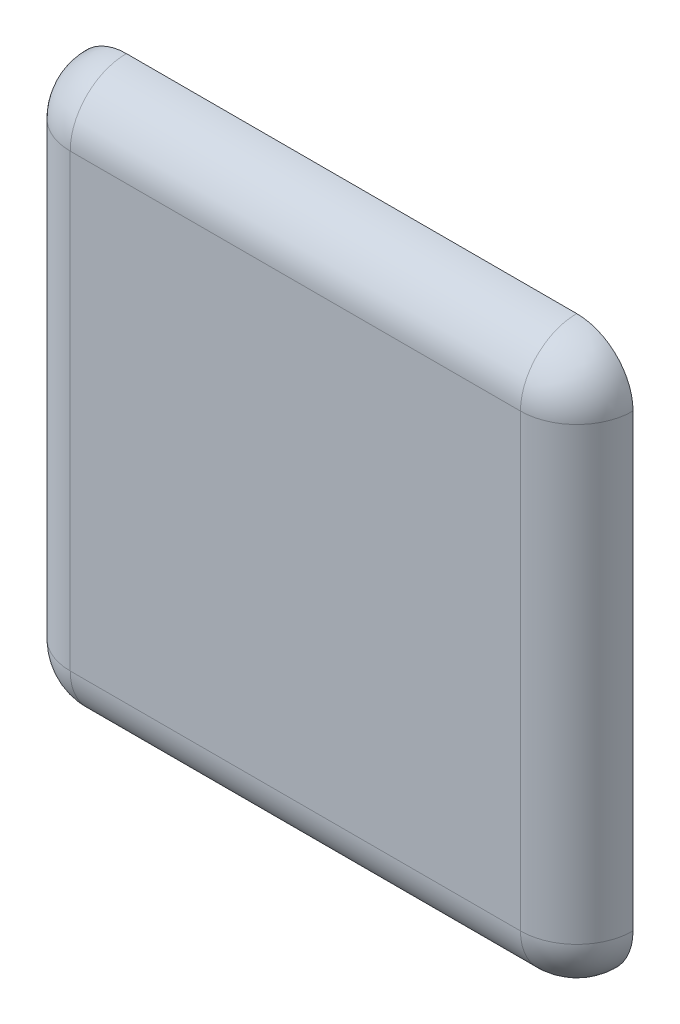
ISO-10303-21;
HEADER;
FILE_DESCRIPTION(('STEP AP214'),'2;1');
FILE_NAME('part.step','',(''),(''),'','','');
FILE_SCHEMA(('AUTOMOTIVE_DESIGN { 1 0 10303 214 1 1 1 1 }'));
ENDSEC;
DATA;
#1=APPLICATION_CONTEXT('core data for automotive mechanical design processes');
#2=APPLICATION_PROTOCOL_DEFINITION('international standard','automotive_design',2000,#1);
#3=PRODUCT_CONTEXT('',#1,'mechanical');
#4=PRODUCT('Part','Part','',(#3));
#5=PRODUCT_RELATED_PRODUCT_CATEGORY('part','',(#4));
#6=PRODUCT_DEFINITION_FORMATION('','',#4);
#7=PRODUCT_DEFINITION_CONTEXT('part definition',#1,'design');
#8=PRODUCT_DEFINITION('design','',#6,#7);
#9=PRODUCT_DEFINITION_SHAPE('','',#8);
#10=(LENGTH_UNIT() NAMED_UNIT(*) SI_UNIT(.MILLI.,.METRE.));
#11=(NAMED_UNIT(*) PLANE_ANGLE_UNIT() SI_UNIT($,.RADIAN.));
#12=(NAMED_UNIT(*) SI_UNIT($,.STERADIAN.) SOLID_ANGLE_UNIT());
#13=UNCERTAINTY_MEASURE_WITH_UNIT(LENGTH_MEASURE(1.E-05),#10,'distance_accuracy_value','');
#14=(GEOMETRIC_REPRESENTATION_CONTEXT(3) GLOBAL_UNCERTAINTY_ASSIGNED_CONTEXT((#13)) GLOBAL_UNIT_ASSIGNED_CONTEXT((#10,
#11,#12)) REPRESENTATION_CONTEXT('',''));
#15=CARTESIAN_POINT('',(0.,0.,0.));
#16=DIRECTION('',(0.,0.,1.));
#17=DIRECTION('',(1.,0.,0.));
#18=AXIS2_PLACEMENT_3D('',#15,#16,#17);
#19=CARTESIAN_POINT('',(4.,4.,4.));
#20=DIRECTION('',(0.,0.,1.));
#21=DIRECTION('',(1.,0.,0.));
#22=AXIS2_PLACEMENT_3D('',#19,#20,#21);
#23=PLANE('',#22);
#24=DIRECTION('',(-1.,0.,0.));
#25=VECTOR('',#24,1.);
#26=CARTESIAN_POINT('',(36.,4.00000000000005,3.99999999999999));
#27=LINE('',#26,#25);
#28=CARTESIAN_POINT('',(35.9999999997224,4.00000000000002,3.99999999999947));
#29=VERTEX_POINT('',#28);
#30=CARTESIAN_POINT('',(3.99999999999996,4.00000000000002,4.00000000000005));
#31=VERTEX_POINT('',#30);
#32=EDGE_CURVE('E90',#29,#31,#27,.T.);
#33=ORIENTED_EDGE('',*,*,#32,.F.);
#34=DIRECTION('',(0.,-1.,0.));
#35=VECTOR('',#34,1.);
#36=CARTESIAN_POINT('',(36.,36.,3.99999999999896));
#37=LINE('',#36,#35);
#38=CARTESIAN_POINT('',(36.,35.9999946842105,3.99999999999953));
#39=VERTEX_POINT('',#38);
#40=EDGE_CURVE('E67',#39,#29,#37,.T.);
#41=ORIENTED_EDGE('',*,*,#40,.F.);
#42=DIRECTION('',(1.,0.,0.));
#43=VECTOR('',#42,1.);
#44=CARTESIAN_POINT('',(4.,35.999996,4.));
#45=LINE('',#44,#43);
#46=CARTESIAN_POINT('',(3.99999712928426,35.9999935086057,3.99999999999928));
#47=VERTEX_POINT('',#46);
#48=EDGE_CURVE('E112',#47,#39,#45,.T.);
#49=ORIENTED_EDGE('',*,*,#48,.F.);
#50=DIRECTION('',(0.,-1.,0.));
#51=VECTOR('',#50,1.);
#52=CARTESIAN_POINT('',(4.,36.,4.00000000000012));
#53=LINE('',#52,#51);
#54=EDGE_CURVE('E91',#31,#47,#53,.F.);
#55=ORIENTED_EDGE('',*,*,#54,.F.);
#56=EDGE_LOOP('',(#33,#41,#49,#55));
#57=FACE_BOUND('',#56,.T.);
#58=ADVANCED_FACE('F16',(#57),#23,.T.);
#59=CARTESIAN_POINT('',(36.,36.,0.));
#60=DIRECTION('',(0.381049633011538,-0.924554583127342,0.));
#61=DIRECTION('',(0.,0.,-1.));
#62=AXIS2_PLACEMENT_3D('',#59,#60,#61);
#63=SPHERICAL_SURFACE('',#62,3.99999999999981);
#64=CARTESIAN_POINT('',(36.,39.9999999999998,0.));
#65=CARTESIAN_POINT('',(36.1125064846693,40.0000107801648,0.));
#66=CARTESIAN_POINT('',(36.2250078596814,39.9952533978363,0.));
#67=CARTESIAN_POINT('',(36.4492056808409,39.9762857323358,0.));
#68=CARTESIAN_POINT('',(36.5609021653405,39.9620759026152,0.));
#69=CARTESIAN_POINT('',(36.7826226412642,39.9243010286425,0.));
#70=CARTESIAN_POINT('',(36.8926478326796,39.900743061469,0.));
#71=CARTESIAN_POINT('',(37.1102957536248,39.844463003552,0.));
#72=CARTESIAN_POINT('',(37.2179185124643,39.8117410246754,0.));
#73=CARTESIAN_POINT('',(37.5361447238502,39.7000934071667,0.));
#74=CARTESIAN_POINT('',(37.7421963398768,39.6076706332295,0.));
#75=CARTESIAN_POINT('',(38.1357069471823,39.3896049845834,0.));
#76=CARTESIAN_POINT('',(38.3231692057971,39.2639679620187,0.));
#77=CARTESIAN_POINT('',(38.6743715803179,38.9829981889779,0.));
#78=CARTESIAN_POINT('',(38.8381119277055,38.8276657283084,0.));
#79=CARTESIAN_POINT('',(39.1372150568841,38.4916826745307,0.));
#80=CARTESIAN_POINT('',(39.2725722809908,38.3110271344569,0.));
#81=CARTESIAN_POINT('',(39.5110563074748,37.9295368825368,0.));
#82=CARTESIAN_POINT('',(39.6141767999037,37.7286982302454,0.));
#83=CARTESIAN_POINT('',(39.7851821448691,37.3125987428058,0.));
#84=CARTESIAN_POINT('',(39.85308763485,37.0973464383638,0.));
#85=CARTESIAN_POINT('',(39.9348605214169,36.7339807389415,0.));
#86=CARTESIAN_POINT('',(39.9592730691926,36.5881531888869,0.));
#87=CARTESIAN_POINT('',(39.9918406722692,36.2949041344534,0.));
#88=CARTESIAN_POINT('',(40.0000187754479,36.1474851889585,0.));
#89=CARTESIAN_POINT('',(39.9999999999998,36.0000000000001,0.));
#90=B_SPLINE_CURVE_WITH_KNOTS('',3,(#64,#65,#66,#67,#68,#69,#70,#71,#72,#73,#74,#75,#76,#77,#78,
#79,#80,#81,#82,#83,#84,#85,#86,#87,#88,#89),.UNSPECIFIED.,.F.,.F.,(4,2,2,2,2,2,2,2,2,2,2,2,4),
(0.,0.337409690213665,0.67480319543045,1.01194176015813,1.34907620955057,2.0230739401626,
2.69695299561828,3.37082547482495,4.04482978167727,4.71896593418993,5.39270656736756,
5.83543557899232,6.27753560189483),.UNSPECIFIED.);
#91=CARTESIAN_POINT('',(36.,39.9999947435897,0.));
#92=VERTEX_POINT('',#91);
#93=CARTESIAN_POINT('',(39.9999999999998,36.,0.));
#94=VERTEX_POINT('',#93);
#95=EDGE_CURVE('E114',#92,#94,#90,.T.);
#96=ORIENTED_EDGE('',*,*,#95,.F.);
#97=CARTESIAN_POINT('',(36.,39.9999999999998,0.));
#98=CARTESIAN_POINT('',(35.9998688575037,40.0000019971717,0.0741499115087347));
#99=CARTESIAN_POINT('',(35.9996634653782,39.9979381764213,0.148297534384109));
#100=CARTESIAN_POINT('',(35.9993613868557,39.9897283979858,0.29575447126633));
#101=CARTESIAN_POINT('',(35.9992638198746,39.9836161701219,0.369065662874321));
#102=CARTESIAN_POINT('',(35.9994259186972,39.9671710629177,0.516927306225582));
#103=CARTESIAN_POINT('',(35.9996938654899,39.9567442001479,0.591467402446289));
#104=CARTESIAN_POINT('',(35.9999296973092,39.9377551802846,0.703986049895479));
#105=CARTESIAN_POINT('',(35.9999800093617,39.9307260849795,0.742229077632274));
#106=CARTESIAN_POINT('',(36.0000180127648,39.9163065782062,0.814720880166266));
#107=CARTESIAN_POINT('',(36.0000114072958,39.9090207240106,0.848990480687904));
#108=CARTESIAN_POINT('',(36.0000189047329,39.8853680474023,0.953473393796539));
#109=CARTESIAN_POINT('',(36.0000623030139,39.8675476206768,1.02336344051721));
#110=CARTESIAN_POINT('',(36.0001028626414,39.8272511846955,1.1652622400748));
#111=CARTESIAN_POINT('',(36.0000978075734,39.8045988657436,1.2372207646469));
#112=CARTESIAN_POINT('',(36.000044814736,39.7540029992481,1.38338079503995));
#113=CARTESIAN_POINT('',(35.9999947026982,39.7258484896679,1.45750948079151));
#114=CARTESIAN_POINT('',(36.000004639236,39.6689556082825,1.59486157769519));
#115=CARTESIAN_POINT('',(36.0000517762732,39.6407242551765,1.65829574165852));
#116=CARTESIAN_POINT('',(36.0001198970815,39.5791706206391,1.78744597654392));
#117=CARTESIAN_POINT('',(36.000139103254,39.5456424891737,1.85306403062664));
#118=CARTESIAN_POINT('',(36.0001149896539,39.4729108847294,1.98619729919671));
#119=CARTESIAN_POINT('',(36.0000678837092,39.4334884819679,2.05359328335936));
#120=CARTESIAN_POINT('',(36.000015516438,39.3705707533184,2.15427691551824));
#121=CARTESIAN_POINT('',(36.0000010182437,39.3484825750178,2.18845146157392));
#122=CARTESIAN_POINT('',(35.9999991447019,39.306891573991,2.25069680361676));
#123=CARTESIAN_POINT('',(36.0000078002655,39.2875406688526,2.27886920498947));
#124=CARTESIAN_POINT('',(36.0000382400153,39.2265658435209,2.36524668665095));
#125=CARTESIAN_POINT('',(36.0000640297925,39.1837276153498,2.42260157090797));
#126=CARTESIAN_POINT('',(36.0000856046635,39.0923680353393,2.53830984038226));
#127=CARTESIAN_POINT('',(36.0000794896678,39.0436598014502,2.59651541754769));
#128=CARTESIAN_POINT('',(36.0000253786692,38.9401373063948,2.71330480141099));
#129=CARTESIAN_POINT('',(35.9999750133001,38.8851332277528,2.77172075077228));
#130=CARTESIAN_POINT('',(36.0000194453896,38.7842967565233,2.8725577038434));
#131=CARTESIAN_POINT('',(36.0000845271058,38.7391355720171,2.91565289344596));
#132=CARTESIAN_POINT('',(36.0002707532634,38.6438076798909,3.00244972413262));
#133=CARTESIAN_POINT('',(36.0003953050456,38.5935071443467,3.04600466240609));
#134=CARTESIAN_POINT('',(36.0006047991188,38.4876078714315,3.13317702498547));
#135=CARTESIAN_POINT('',(36.0006868010711,38.431874099811,3.17663033808881));
#136=CARTESIAN_POINT('',(36.0007768580552,38.314844027704,3.26298781235745));
#137=CARTESIAN_POINT('',(36.0007802932934,38.2534132077562,3.30571024444259));
#138=CARTESIAN_POINT('',(36.0007265322902,38.158249251415,3.3680079765191));
#139=CARTESIAN_POINT('',(36.0006975988755,38.1253483104449,3.38886582840333));
#140=CARTESIAN_POINT('',(36.0006233074174,38.0580666191379,3.43015454418903));
#141=CARTESIAN_POINT('',(36.0005775327533,38.0236697888585,3.45055927162724));
#142=CARTESIAN_POINT('',(36.0004753544422,37.9533814501278,3.49084284978111));
#143=CARTESIAN_POINT('',(36.0004187062404,37.9174743022124,3.51069439831566));
#144=CARTESIAN_POINT('',(36.000304047729,37.8441537545001,3.54976981508934));
#145=CARTESIAN_POINT('',(36.0002460390726,37.8067252005113,3.56896525453618));
#146=CARTESIAN_POINT('',(36.000139387514,37.7303556278612,3.60662253508331));
#147=CARTESIAN_POINT('',(36.0000910092802,37.6914000305486,3.62505482780203));
#148=CARTESIAN_POINT('',(36.0000229758341,37.6119771490796,3.66107585071195));
#149=CARTESIAN_POINT('',(36.0000040341745,37.5714959811056,3.67863392225586));
#150=CARTESIAN_POINT('',(35.9999938022796,37.4681104994478,3.72145741419337));
#151=CARTESIAN_POINT('',(36.0000227896744,37.4048238469085,3.74580622390123));
#152=CARTESIAN_POINT('',(36.000059954361,37.2718119037336,3.79313618377973));
#153=CARTESIAN_POINT('',(36.0000662111509,37.2019871708334,3.81583743583964));
#154=CARTESIAN_POINT('',(36.0000560939482,37.0558047467433,3.85895291631939));
#155=CARTESIAN_POINT('',(36.0000379528638,36.9793557789751,3.87905952434512));
#156=CARTESIAN_POINT('',(36.0000045727092,36.8618498112004,3.90627021448755));
#157=CARTESIAN_POINT('',(35.9999920242894,36.8211682202525,3.91502411032708));
#158=CARTESIAN_POINT('',(36.0000050867305,36.7543347485663,3.92831812717278));
#159=CARTESIAN_POINT('',(36.0000185218646,36.7282575105623,3.93323601655372));
#160=CARTESIAN_POINT('',(36.0000757928939,36.6391976321281,3.94911537626633));
#161=CARTESIAN_POINT('',(36.0001357909835,36.5759857363489,3.95882890007477));
#162=CARTESIAN_POINT('',(36.0001739822513,36.475491656866,3.97181407931485));
#163=CARTESIAN_POINT('',(36.0001757900704,36.4383342948666,3.97608626054823));
#164=CARTESIAN_POINT('',(36.0001627179511,36.3603074709583,3.98395044168892));
#165=CARTESIAN_POINT('',(36.000146204117,36.3194271745855,3.98743642876922));
#166=CARTESIAN_POINT('',(36.000101208211,36.2339652583028,3.99340123801248));
#167=CARTESIAN_POINT('',(36.0000717981246,36.1893755413413,3.99576395197174));
#168=CARTESIAN_POINT('',(36.0000210919496,36.0965257686974,3.99912651788117));
#169=CARTESIAN_POINT('',(36.0000006466145,36.0482611232549,4.00000040035484));
#170=CARTESIAN_POINT('',(36.,35.999996,3.99999999999781));
#171=B_SPLINE_CURVE_WITH_KNOTS('',3,(#97,#98,#99,#100,#101,#102,#103,#104,#105,#106,#107,#108,
#109,#110,#111,#112,#113,#114,#115,#116,#117,#118,#119,#120,#121,#122,#123,#124,#125,#126,#127,
#128,#129,#130,#131,#132,#133,#134,#135,#136,#137,#138,#139,#140,#141,#142,#143,#144,#145,#146,
#147,#148,#149,#150,#151,#152,#153,#154,#155,#156,#157,#158,#159,#160,#161,#162,#163,#164,#165,
#166,#167,#168,#169,#170),.UNSPECIFIED.,.F.,.F.,(4,2,2,2,2,2,2,2,2,2,2,2,2,2,2,2,2,2,2,2,2,2,2,
2,2,2,2,2,2,2,2,2,2,2,2,2,4),(0.,0.222417107578206,0.443004044110374,0.668672421346964,
0.785308823638932,0.890405222375579,1.10666933983325,1.33287163712365,1.57061238118346,
1.77881939773179,1.9997717475497,2.23386354770104,2.35592082185082,2.45844574378606,
2.673094651718,2.90066765537036,3.14122346247322,3.32843111354935,3.52795779172504,
3.73987604251078,3.96422516151148,4.0810776682581,4.20104000281386,4.32410892820753,
4.45027954738558,4.57954535153261,4.71189826888605,4.91523264939009,5.13539273468387,
5.37238779162185,5.49720749150748,5.57681471375602,5.76858810199226,5.88078288114727,
6.00384852654176,6.13778054109232,6.28256687091075),.UNSPECIFIED.);
#172=EDGE_CURVE('E109',#39,#92,#171,.F.);
#173=ORIENTED_EDGE('',*,*,#172,.F.);
#174=CARTESIAN_POINT('',(36.0000000000002,36.,-5.14996031930615E-13));
#175=DIRECTION('',(0.,-1.,0.));
#176=DIRECTION('',(0.,0.,-1.));
#177=AXIS2_PLACEMENT_3D('',#174,#175,#176);
#178=CIRCLE('',#177,3.99999999999947);
#179=EDGE_CURVE('E74',#94,#39,#178,.T.);
#180=ORIENTED_EDGE('',*,*,#179,.F.);
#181=EDGE_LOOP('',(#96,#173,#180));
#182=FACE_BOUND('',#181,.T.);
#183=ADVANCED_FACE('F125',(#182),#63,.T.);
#184=CARTESIAN_POINT('',(36.0000000000002,36.,-5.14996031930615E-13));
#185=DIRECTION('',(0.,-1.,0.));
#186=DIRECTION('',(0.,0.,-1.));
#187=AXIS2_PLACEMENT_3D('',#184,#185,#186);
#188=CYLINDRICAL_SURFACE('',#187,3.99999999999947);
#189=CARTESIAN_POINT('',(36.0000000000002,4.,-5.14996031930615E-13));
#190=DIRECTION('',(0.,-1.,0.));
#191=DIRECTION('',(0.,0.,-1.));
#192=AXIS2_PLACEMENT_3D('',#189,#190,#191);
#193=CIRCLE('',#192,3.99999999999947);
#194=CARTESIAN_POINT('',(39.9999999999999,4.,0.));
#195=VERTEX_POINT('',#194);
#196=EDGE_CURVE('E71',#195,#29,#193,.T.);
#197=ORIENTED_EDGE('',*,*,#196,.F.);
#198=DIRECTION('',(0.,1.,0.));
#199=VECTOR('',#198,1.);
#200=CARTESIAN_POINT('',(39.9999999999999,0.,0.));
#201=LINE('',#200,#199);
#202=EDGE_CURVE('E212',#94,#195,#201,.F.);
#203=ORIENTED_EDGE('',*,*,#202,.F.);
#204=ORIENTED_EDGE('',*,*,#179,.T.);
#205=ORIENTED_EDGE('',*,*,#40,.T.);
#206=EDGE_LOOP('',(#197,#203,#204,#205));
#207=FACE_BOUND('',#206,.T.);
#208=ADVANCED_FACE('F69',(#207),#188,.T.);
#209=CARTESIAN_POINT('',(36.,4.,0.));
#210=DIRECTION('',(-0.924554583722734,-0.381049631566916,0.));
#211=DIRECTION('',(0.,0.,-1.));
#212=AXIS2_PLACEMENT_3D('',#209,#210,#211);
#213=SPHERICAL_SURFACE('',#212,4.00000000000004);
#214=CARTESIAN_POINT('',(40.,4.,0.));
#215=CARTESIAN_POINT('',(40.0000107801651,3.88749351533068,0.));
#216=CARTESIAN_POINT('',(39.9952533978365,3.77499214031856,0.));
#217=CARTESIAN_POINT('',(39.9762857323361,3.55079431915905,0.));
#218=CARTESIAN_POINT('',(39.9620759026154,3.43909783465939,0.));
#219=CARTESIAN_POINT('',(39.9243010286428,3.21737735873567,0.));
#220=CARTESIAN_POINT('',(39.9007430614692,3.10735216732032,0.));
#221=CARTESIAN_POINT('',(39.8444630035522,2.88970424637512,0.));
#222=CARTESIAN_POINT('',(39.8117410246756,2.78208148753563,0.));
#223=CARTESIAN_POINT('',(39.7000934071669,2.46385527614969,0.));
#224=CARTESIAN_POINT('',(39.6076706332297,2.2578036601231,0.));
#225=CARTESIAN_POINT('',(39.3896049845836,1.8642930528176,0.));
#226=CARTESIAN_POINT('',(39.2639679620188,1.67683079420275,0.));
#227=CARTESIAN_POINT('',(38.9829981889781,1.32562841968195,0.));
#228=CARTESIAN_POINT('',(38.8276657283085,1.16188807229427,0.));
#229=CARTESIAN_POINT('',(38.4916826745307,0.862784943115719,0.));
#230=CARTESIAN_POINT('',(38.311027134457,0.727427719008949,0.));
#231=CARTESIAN_POINT('',(37.9295368825369,0.488943692525088,0.));
#232=CARTESIAN_POINT('',(37.7286982302457,0.385823200096153,0.));
#233=CARTESIAN_POINT('',(37.3125987428061,0.214817855130728,0.));
#234=CARTESIAN_POINT('',(37.097346438364,0.146912365149814,0.));
#235=CARTESIAN_POINT('',(36.7339807388513,0.0651394785626091,0.));
#236=CARTESIAN_POINT('',(36.5881531887041,0.0407269307766143,0.));
#237=CARTESIAN_POINT('',(36.2949041340843,0.00815932769984238,0.));
#238=CARTESIAN_POINT('',(36.1474851884957,-1.87754686897813E-05,0.));
#239=CARTESIAN_POINT('',(35.9999999994447,0.,0.));
#240=B_SPLINE_CURVE_WITH_KNOTS('',3,(#214,#215,#216,#217,#218,#219,#220,#221,#222,#223,#224,
#225,#226,#227,#228,#229,#230,#231,#232,#233,#234,#235,#236,#237,#238,#239),.UNSPECIFIED.,.F.,
.F.,(4,2,2,2,2,2,2,2,2,2,2,2,4),(0.,0.337409690213699,0.674803195430522,1.01194176015821,
1.34907620955065,2.02307394016269,2.69695299561845,3.37082547482525,4.04482978167751,
4.71896593418987,5.39270656736788,5.8354355792698,6.27753560244972),.UNSPECIFIED.);
#241=CARTESIAN_POINT('',(35.9999999994446,0.,0.));
#242=VERTEX_POINT('',#241);
#243=EDGE_CURVE('E86',#195,#242,#240,.T.);
#244=ORIENTED_EDGE('',*,*,#243,.F.);
#245=ORIENTED_EDGE('',*,*,#196,.T.);
#246=CARTESIAN_POINT('',(35.9999999994446,4.00000000000005,0.));
#247=DIRECTION('',(-1.,0.,0.));
#248=DIRECTION('',(0.,0.,1.));
#249=AXIS2_PLACEMENT_3D('',#246,#247,#248);
#250=CIRCLE('',#249,4.);
#251=EDGE_CURVE('E83',#242,#29,#250,.T.);
#252=ORIENTED_EDGE('',*,*,#251,.F.);
#253=EDGE_LOOP('',(#244,#245,#252));
#254=FACE_BOUND('',#253,.T.);
#255=ADVANCED_FACE('F81',(#254),#213,.T.);
#256=CARTESIAN_POINT('',(36.,4.00000000000005,0.));
#257=DIRECTION('',(-1.,0.,0.));
#258=DIRECTION('',(0.,0.,1.));
#259=AXIS2_PLACEMENT_3D('',#256,#257,#258);
#260=CYLINDRICAL_SURFACE('',#259,4.);
#261=ORIENTED_EDGE('',*,*,#251,.T.);
#262=ORIENTED_EDGE('',*,*,#32,.T.);
#263=CARTESIAN_POINT('',(4.,4.00000000000005,0.));
#264=DIRECTION('',(-1.,0.,0.));
#265=DIRECTION('',(0.,0.,1.));
#266=AXIS2_PLACEMENT_3D('',#263,#264,#265);
#267=CIRCLE('',#266,4.);
#268=CARTESIAN_POINT('',(4.,0.,0.));
#269=VERTEX_POINT('',#268);
#270=EDGE_CURVE('E95',#269,#31,#267,.T.);
#271=ORIENTED_EDGE('',*,*,#270,.F.);
#272=DIRECTION('',(-1.,0.,0.));
#273=VECTOR('',#272,1.);
#274=CARTESIAN_POINT('',(40.,0.,0.));
#275=LINE('',#274,#273);
#276=EDGE_CURVE('E99',#242,#269,#275,.T.);
#277=ORIENTED_EDGE('',*,*,#276,.F.);
#278=EDGE_LOOP('',(#261,#262,#271,#277));
#279=FACE_BOUND('',#278,.T.);
#280=ADVANCED_FACE('F97',(#279),#260,.T.);
#281=CARTESIAN_POINT('',(4.,4.,0.));
#282=DIRECTION('',(-0.381049631566923,0.924554583722731,0.));
#283=DIRECTION('',(0.,0.,-1.));
#284=AXIS2_PLACEMENT_3D('',#281,#282,#283);
#285=SPHERICAL_SURFACE('',#284,4.00000000000001);
#286=CARTESIAN_POINT('',(4.,0.,0.));
#287=CARTESIAN_POINT('',(3.88749351533069,-1.07801650150983E-05,0.));
#288=CARTESIAN_POINT('',(3.77499214031857,0.00474660216351378,0.));
#289=CARTESIAN_POINT('',(3.55079431915907,0.0237142676639687,0.));
#290=CARTESIAN_POINT('',(3.43909783465941,0.0379240973845905,0.));
#291=CARTESIAN_POINT('',(3.21737735873569,0.0756989713572767,0.));
#292=CARTESIAN_POINT('',(3.10735216732034,0.0992569385308615,0.));
#293=CARTESIAN_POINT('',(2.88970424637514,0.155536996447869,0.));
#294=CARTESIAN_POINT('',(2.78208148753564,0.188258975324456,0.));
#295=CARTESIAN_POINT('',(2.46385527614969,0.299906592833119,0.));
#296=CARTESIAN_POINT('',(2.25780366012309,0.392329366770341,0.));
#297=CARTESIAN_POINT('',(1.8642930528176,0.610395015416484,0.));
#298=CARTESIAN_POINT('',(1.67683079420276,0.736032037981204,0.));
#299=CARTESIAN_POINT('',(1.32562841968199,1.01700181102196,0.));
#300=CARTESIAN_POINT('',(1.16188807229433,1.17233427169145,0.));
#301=CARTESIAN_POINT('',(0.86278494311578,1.50831732546924,0.));
#302=CARTESIAN_POINT('',(0.727427719008988,1.68897286554305,0.));
#303=CARTESIAN_POINT('',(0.488943692525055,2.07046311746318,0.));
#304=CARTESIAN_POINT('',(0.38582320009608,2.27130176975454,0.));
#305=CARTESIAN_POINT('',(0.214817855130688,2.68740125719416,0.));
#306=CARTESIAN_POINT('',(0.146912365149812,2.90265356163622,0.));
#307=CARTESIAN_POINT('',(0.0651394785829444,3.26601926105849,0.));
#308=CARTESIAN_POINT('',(0.0407269308072261,3.41184681111313,0.));
#309=CARTESIAN_POINT('',(0.00815932773058105,3.70509586554663,0.));
#310=CARTESIAN_POINT('',(-1.87754480955368E-05,3.85251481104155,0.));
#311=CARTESIAN_POINT('',(0.,3.99999999999994,0.));
#312=B_SPLINE_CURVE_WITH_KNOTS('',3,(#286,#287,#288,#289,#290,#291,#292,#293,#294,#295,#296,
#297,#298,#299,#300,#301,#302,#303,#304,#305,#306,#307,#308,#309,#310,#311),.UNSPECIFIED.,.F.,
.F.,(4,2,2,2,2,2,2,2,2,2,2,2,4),(0.,0.337409690213687,0.674803195430496,1.0119417601582,
1.34907620955064,2.02307394016271,2.69695299561843,3.37082547482513,4.04482978167748,
4.71896593419017,5.39270656736783,5.8354355789926,6.27753560189512),.UNSPECIFIED.);
#313=CARTESIAN_POINT('',(0.,4.,0.));
#314=VERTEX_POINT('',#313);
#315=EDGE_CURVE('E197',#269,#314,#312,.T.);
#316=ORIENTED_EDGE('',*,*,#315,.F.);
#317=ORIENTED_EDGE('',*,*,#270,.T.);
#318=CARTESIAN_POINT('',(3.99999999999993,4.,0.));
#319=DIRECTION('',(0.,-1.,0.));
#320=DIRECTION('',(0.,0.,-1.));
#321=AXIS2_PLACEMENT_3D('',#318,#319,#320);
#322=CIRCLE('',#321,4.00000000000005);
#323=EDGE_CURVE('E103',#314,#31,#322,.F.);
#324=ORIENTED_EDGE('',*,*,#323,.F.);
#325=EDGE_LOOP('',(#316,#317,#324));
#326=FACE_BOUND('',#325,.T.);
#327=ADVANCED_FACE('F190',(#326),#285,.T.);
#328=CARTESIAN_POINT('',(3.99999999999993,36.,0.));
#329=DIRECTION('',(0.,-1.,0.));
#330=DIRECTION('',(0.,0.,-1.));
#331=AXIS2_PLACEMENT_3D('',#328,#329,#330);
#332=CYLINDRICAL_SURFACE('',#331,4.00000000000005);
#333=CARTESIAN_POINT('',(3.99999999999993,35.9999958196107,0.));
#334=DIRECTION('',(0.,-1.,0.));
#335=DIRECTION('',(0.,0.,-1.));
#336=AXIS2_PLACEMENT_3D('',#333,#334,#335);
#337=CIRCLE('',#336,4.00000000000005);
#338=CARTESIAN_POINT('',(0.,35.9999974917664,0.));
#339=VERTEX_POINT('',#338);
#340=EDGE_CURVE('E107',#339,#47,#337,.F.);
#341=ORIENTED_EDGE('',*,*,#340,.F.);
#342=DIRECTION('',(0.,1.,0.));
#343=VECTOR('',#342,1.);
#344=CARTESIAN_POINT('',(0.,0.,0.));
#345=LINE('',#344,#343);
#346=EDGE_CURVE('E203',#314,#339,#345,.T.);
#347=ORIENTED_EDGE('',*,*,#346,.F.);
#348=ORIENTED_EDGE('',*,*,#323,.T.);
#349=ORIENTED_EDGE('',*,*,#54,.T.);
#350=EDGE_LOOP('',(#341,#347,#348,#349));
#351=FACE_BOUND('',#350,.T.);
#352=ADVANCED_FACE('F194',(#351),#332,.T.);
#353=CARTESIAN_POINT('',(4.,36.,0.));
#354=DIRECTION('',(0.923908140645023,0.382614358917508,0.));
#355=DIRECTION('',(0.,0.,-1.));
#356=AXIS2_PLACEMENT_3D('',#353,#354,#355);
#357=SPHERICAL_SURFACE('',#356,3.99999999999997);
#358=ORIENTED_EDGE('',*,*,#340,.T.);
#359=CARTESIAN_POINT('',(3.99999581949664,35.9999958196107,3.9999999999956));
#360=CARTESIAN_POINT('',(3.99980230712138,36.0117413887162,4.00000001072928));
#361=CARTESIAN_POINT('',(3.99963818135989,36.0234873206887,3.99994827455825));
#362=CARTESIAN_POINT('',(3.99907175719936,36.0701952203526,3.99953677615179));
#363=CARTESIAN_POINT('',(3.99883990468441,36.1051559890462,3.99877030333691));
#364=CARTESIAN_POINT('',(3.9981931012342,36.1982410886193,3.99550762773641));
#365=CARTESIAN_POINT('',(3.99775875804177,36.2563389999304,3.99220103457544));
#366=CARTESIAN_POINT('',(3.99716232422496,36.3519998411994,3.98466009406607));
#367=CARTESIAN_POINT('',(3.99695816919076,36.3896223468763,3.98115723556259));
#368=CARTESIAN_POINT('',(3.99658128568899,36.4705058761758,3.97246904994545));
#369=CARTESIAN_POINT('',(3.99641815335104,36.5137483371058,3.96710824636914));
#370=CARTESIAN_POINT('',(3.99613304968427,36.5981462713442,3.95524232153441));
#371=CARTESIAN_POINT('',(3.99600958942206,36.6393102572986,3.94879754817676));
#372=CARTESIAN_POINT('',(3.99574162488532,36.7205047216621,3.93478260536217));
#373=CARTESIAN_POINT('',(3.99559764903514,36.7605400661734,3.92724061728693));
#374=CARTESIAN_POINT('',(3.99531553579724,36.839452777442,3.91112280852448));
#375=CARTESIAN_POINT('',(3.99517734012201,36.8783357479178,3.90257445133932));
#376=CARTESIAN_POINT('',(3.99490927546876,36.954922982924,3.88453444746861));
#377=CARTESIAN_POINT('',(3.99477928739905,36.9926335667224,3.87506949502884));
#378=CARTESIAN_POINT('',(3.99441616024794,37.1026273786101,3.84575074165827));
#379=CARTESIAN_POINT('',(3.99419923427033,37.1745199113297,3.8244068221288));
#380=CARTESIAN_POINT('',(3.99384841925271,37.3134456284064,3.77887525837764));
#381=CARTESIAN_POINT('',(3.9937109385281,37.3805427199365,3.75488171516127));
#382=CARTESIAN_POINT('',(3.99351784013837,37.5098900268772,3.70469262407939));
#383=CARTESIAN_POINT('',(3.99345831989336,37.5722102941536,3.67867767432222));
#384=CARTESIAN_POINT('',(3.99339803045217,37.6920647230928,3.62504395376181));
#385=CARTESIAN_POINT('',(3.99339421041944,37.7496736184933,3.59759205221019));
#386=CARTESIAN_POINT('',(3.99340965147694,37.8602133290945,3.54163449919905));
#387=CARTESIAN_POINT('',(3.99342758781292,37.913221773913,3.51328210750966));
#388=CARTESIAN_POINT('',(3.99342226854409,38.0147043409736,3.45602467539829));
#389=CARTESIAN_POINT('',(3.99340146617307,38.0632574505302,3.42725959422551));
#390=CARTESIAN_POINT('',(3.99329816888066,38.1529275043104,3.37153885359289));
#391=CARTESIAN_POINT('',(3.99322396786418,38.1941965455261,3.34482757151727));
#392=CARTESIAN_POINT('',(3.99306873480684,38.2752573093025,3.29021535714792));
#393=CARTESIAN_POINT('',(3.99298779035297,38.3150605143831,3.26233147307002));
#394=CARTESIAN_POINT('',(3.99281859862391,38.3931731979376,3.20546058933545));
#395=CARTESIAN_POINT('',(3.99273044591336,38.4314945825437,3.17648993979876));
#396=CARTESIAN_POINT('',(3.99255640249882,38.506632593143,3.11752974779423));
#397=CARTESIAN_POINT('',(3.99247049742837,38.5434614870973,3.08755583875398));
#398=CARTESIAN_POINT('',(3.99230577355988,38.6156079522783,3.02667110019087));
#399=CARTESIAN_POINT('',(3.99222688412507,38.6509380985566,2.99577517075385));
#400=CARTESIAN_POINT('',(3.99208028757637,38.7200847979873,2.93312583009765));
#401=CARTESIAN_POINT('',(3.99201246105484,38.7539141776232,2.90138657493129));
#402=CARTESIAN_POINT('',(3.99189042406719,38.8200609999716,2.83712733499626));
#403=CARTESIAN_POINT('',(3.99183606415892,38.8523914665855,2.80462075607245));
#404=CARTESIAN_POINT('',(3.99174210100258,38.9155457322607,2.73890078523199));
#405=CARTESIAN_POINT('',(3.99170233314622,38.9463826999952,2.70570004727542));
#406=CARTESIAN_POINT('',(3.99163742818122,39.0065585280729,2.63866272576257));
#407=CARTESIAN_POINT('',(3.99161212611123,39.0359106510055,2.60483804669394));
#408=CARTESIAN_POINT('',(3.99157487379001,39.0931283276889,2.53662077266664));
#409=CARTESIAN_POINT('',(3.99156277185547,39.1210071890681,2.50223933891038));
#410=CARTESIAN_POINT('',(3.99154958550146,39.1752925527751,2.4329733850464));
#411=CARTESIAN_POINT('',(3.99154837519332,39.2017123610728,2.39809929247477));
#412=CARTESIAN_POINT('',(3.99155364980757,39.2530962036209,2.32790971146188));
#413=CARTESIAN_POINT('',(3.99156004628124,39.2780734978172,2.29260392960903));
#414=CARTESIAN_POINT('',(3.99157641392606,39.3265909848508,2.22160950543198));
#415=CARTESIAN_POINT('',(3.99158634336366,39.3501443496981,2.18592986423012));
#416=CARTESIAN_POINT('',(3.99160458145437,39.3958344622531,2.11424310427615));
#417=CARTESIAN_POINT('',(3.99161290722472,39.4179842546655,2.07824429912626));
#418=CARTESIAN_POINT('',(3.99162308945754,39.4608892533068,2.0059714707976));
#419=CARTESIAN_POINT('',(3.99162501761006,39.4816573401718,1.96970509371651));
#420=CARTESIAN_POINT('',(3.99161307679835,39.5218222544256,1.89694627698244));
#421=CARTESIAN_POINT('',(3.99159938329582,39.5412317642431,1.86046083801456));
#422=CARTESIAN_POINT('',(3.99156067452674,39.5785139867416,1.78768082803682));
#423=CARTESIAN_POINT('',(3.99153590383138,39.5964104595083,1.75139842645238));
#424=CARTESIAN_POINT('',(3.99148771101515,39.6310176664271,1.67846957664156));
#425=CARTESIAN_POINT('',(3.99146428340185,39.6477333061592,1.64182545583341));
#426=CARTESIAN_POINT('',(3.99141714811205,39.6799820922886,1.56820476581447));
#427=CARTESIAN_POINT('',(3.99139344203873,39.6955199400839,1.5312302576306));
#428=CARTESIAN_POINT('',(3.99134751343011,39.7254162196467,1.45698135835974));
#429=CARTESIAN_POINT('',(3.99132528532249,39.7397791347209,1.41970876644887));
#430=CARTESIAN_POINT('',(3.99126183358208,39.7810292683826,1.3076884427778));
#431=CARTESIAN_POINT('',(3.99122355664449,39.8062597673814,1.23232255068419));
#432=CARTESIAN_POINT('',(3.99115877454149,39.8520348286771,1.0807303577699));
#433=CARTESIAN_POINT('',(3.99113219321534,39.8726092710369,1.00451304072658));
#434=CARTESIAN_POINT('',(3.99109095930061,39.9091118037817,0.851423730781774));
#435=CARTESIAN_POINT('',(3.99107624070813,39.9250652824035,0.774557798981962));
#436=CARTESIAN_POINT('',(3.99105669724282,39.9523614317378,0.620372038944896));
#437=CARTESIAN_POINT('',(3.99105182774215,39.9637247129727,0.543055857347496));
#438=CARTESIAN_POINT('',(3.99104830415626,39.9818729020806,0.38815744683522));
#439=CARTESIAN_POINT('',(3.99104962876309,39.9886734138334,0.310577046056474));
#440=CARTESIAN_POINT('',(3.9910532466004,39.997728129339,0.155330765340585));
#441=CARTESIAN_POINT('',(3.99105553759302,39.9999927676151,0.0776654937771936));
#442=CARTESIAN_POINT('',(3.9910557336778,39.99999,0.));
#443=B_SPLINE_CURVE_WITH_KNOTS('',3,(#359,#360,#361,#362,#363,#364,#365,#366,#367,#368,#369,
#370,#371,#372,#373,#374,#375,#376,#377,#378,#379,#380,#381,#382,#383,#384,#385,#386,#387,#388,
#389,#390,#391,#392,#393,#394,#395,#396,#397,#398,#399,#400,#401,#402,#403,#404,#405,#406,#407,
#408,#409,#410,#411,#412,#413,#414,#415,#416,#417,#418,#419,#420,#421,#422,#423,#424,#425,#426,
#427,#428,#429,#430,#431,#432,#433,#434,#435,#436,#437,#438,#439,#440,#441,#442),.UNSPECIFIED.,
.F.,.F.,(4,2,2,2,2,2,2,2,2,2,2,2,2,2,2,2,2,2,2,2,2,2,2,2,2,2,2,2,2,2,2,2,2,2,2,2,2,2,2,2,2,4),
(0.,0.0352411705957744,0.140138938449353,0.314657074753866,0.42800148527723,0.558698210627977,
0.683675083941341,0.805875580824521,0.92529243526115,1.04192022309266,1.2667731904463,
1.48044886030221,1.68295818458237,1.87433113455547,2.05461375465707,2.22386554494728,
2.37131062499908,2.51707361764168,2.66116228761196,2.80358669442288,2.94435910733417,
3.0834939216066,3.22100757607235,3.35691847202518,3.49124689340637,3.62401492823707,
3.75524639122448,3.88496674744867,4.0132030370183,4.13998380056788,4.26533900545648,
4.3892999725176,4.51064968146008,4.63146134163203,4.75176213762543,4.87158010556978,
5.10985720254492,5.34655882832022,5.58193418097158,5.81624059847193,6.04974158793731,
6.2827048016232),.UNSPECIFIED.);
#444=CARTESIAN_POINT('',(3.9910557336778,39.9999900000001,0.));
#445=VERTEX_POINT('',#444);
#446=EDGE_CURVE('E34',#445,#47,#443,.F.);
#447=ORIENTED_EDGE('',*,*,#446,.F.);
#448=CARTESIAN_POINT('',(1.20888542232134E-13,35.9999991639221,0.));
#449=CARTESIAN_POINT('',(-1.08036602680166E-05,36.1125055891048,0.));
#450=CARTESIAN_POINT('',(0.00474655010901702,36.2250069055757,0.));
#451=CARTESIAN_POINT('',(0.0237141487189919,36.4492046131365,0.));
#452=CARTESIAN_POINT('',(0.0379239401288589,36.5609010425768,0.));
#453=CARTESIAN_POINT('',(0.0756987480058737,36.7826215298862,0.));
#454=CARTESIAN_POINT('',(0.0992566972685115,36.8926467860701,0.));
#455=CARTESIAN_POINT('',(0.155536729825712,37.1102948362885,0.));
#456=CARTESIAN_POINT('',(0.188258701253682,37.2179176596324,0.));
#457=CARTESIAN_POINT('',(0.299906321575386,37.5361440935112,0.));
#458=CARTESIAN_POINT('',(0.392329125320845,37.742195863901,0.));
#459=CARTESIAN_POINT('',(0.610394741180077,38.1357064926341,0.));
#460=CARTESIAN_POINT('',(0.736031656363265,38.3231686433167,0.));
#461=CARTESIAN_POINT('',(1.01700092884658,38.6743705630556,0.));
#462=CARTESIAN_POINT('',(1.17233295000253,38.8381106006058,0.));
#463=CARTESIAN_POINT('',(1.5083158916695,39.1372139310004,0.));
#464=CARTESIAN_POINT('',(1.68897187216996,39.2725715392177,0.));
#465=CARTESIAN_POINT('',(2.07046380160513,39.5110568559785,0.));
#466=CARTESIAN_POINT('',(2.27130380802191,39.6141780670241,0.));
#467=CARTESIAN_POINT('',(2.6874043920525,39.7851830042701,0.));
#468=CARTESIAN_POINT('',(2.90265620409661,39.8530879338457,0.));
#469=CARTESIAN_POINT('',(3.2645648079556,39.934533399394,0.));
#470=CARTESIAN_POINT('',(3.40890264571548,39.958779674248,0.));
#471=CARTESIAN_POINT('',(3.69915265999843,39.9913420000335,0.));
#472=CARTESIAN_POINT('',(3.84506226239797,39.9996810021726,0.));
#473=CARTESIAN_POINT('',(3.99105573367775,39.99999,0.));
#474=B_SPLINE_CURVE_WITH_KNOTS('',3,(#448,#449,#450,#451,#452,#453,#454,#455,#456,#457,#458,
#459,#460,#461,#462,#463,#464,#465,#466,#467,#468,#469,#470,#471,#472,#473),.UNSPECIFIED.,.F.,
.F.,(4,2,2,2,2,2,2,2,2,2,2,2,4),(0.,0.337409511815624,0.674802839357225,1.01194158211609,
1.34907620955112,2.02307439425509,2.69695299561831,3.37082396922764,4.04482978167521,
4.71897135780502,5.39270656734249,5.83097254762144,6.26860571269523),.UNSPECIFIED.);
#475=EDGE_CURVE('E25',#339,#445,#474,.T.);
#476=ORIENTED_EDGE('',*,*,#475,.F.);
#477=EDGE_LOOP('',(#358,#447,#476));
#478=FACE_BOUND('',#477,.T.);
#479=ADVANCED_FACE('F164',(#478),#357,.T.);
#480=CARTESIAN_POINT('',(36.000051324443,35.99999,0.));
#481=DIRECTION('',(-1.,0.,0.));
#482=DIRECTION('',(0.,0.,1.));
#483=AXIS2_PLACEMENT_3D('',#480,#481,#482);
#484=CYLINDRICAL_SURFACE('',#483,4.00000000000016);
#485=ORIENTED_EDGE('',*,*,#446,.T.);
#486=ORIENTED_EDGE('',*,*,#48,.T.);
#487=ORIENTED_EDGE('',*,*,#172,.T.);
#488=DIRECTION('',(-1.,0.,0.));
#489=VECTOR('',#488,1.);
#490=CARTESIAN_POINT('',(40.,39.99999,0.));
#491=LINE('',#490,#489);
#492=EDGE_CURVE('E11',#445,#92,#491,.F.);
#493=ORIENTED_EDGE('',*,*,#492,.F.);
#494=EDGE_LOOP('',(#485,#486,#487,#493));
#495=FACE_BOUND('',#494,.T.);
#496=ADVANCED_FACE('F155',(#495),#484,.T.);
#497=CARTESIAN_POINT('',(40.,0.,0.));
#498=DIRECTION('',(0.,0.,-1.));
#499=DIRECTION('',(-1.,0.,0.));
#500=AXIS2_PLACEMENT_3D('',#497,#498,#499);
#501=PLANE('',#500);
#502=ORIENTED_EDGE('',*,*,#475,.T.);
#503=ORIENTED_EDGE('',*,*,#492,.T.);
#504=ORIENTED_EDGE('',*,*,#95,.T.);
#505=ORIENTED_EDGE('',*,*,#202,.T.);
#506=ORIENTED_EDGE('',*,*,#243,.T.);
#507=ORIENTED_EDGE('',*,*,#276,.T.);
#508=ORIENTED_EDGE('',*,*,#315,.T.);
#509=ORIENTED_EDGE('',*,*,#346,.T.);
#510=EDGE_LOOP('',(#502,#503,#504,#505,#506,#507,#508,#509));
#511=FACE_BOUND('',#510,.T.);
#512=ADVANCED_FACE('F122',(#511),#501,.T.);
#513=CLOSED_SHELL('',(#58,#183,#208,#255,#280,#327,#352,#479,#496,#512));
#514=MANIFOLD_SOLID_BREP('B1',#513);
#515=ADVANCED_BREP_SHAPE_REPRESENTATION('',(#18,#514),#14);
#516=SHAPE_DEFINITION_REPRESENTATION(#9,#515);
ENDSEC;
END-ISO-10303-21;
